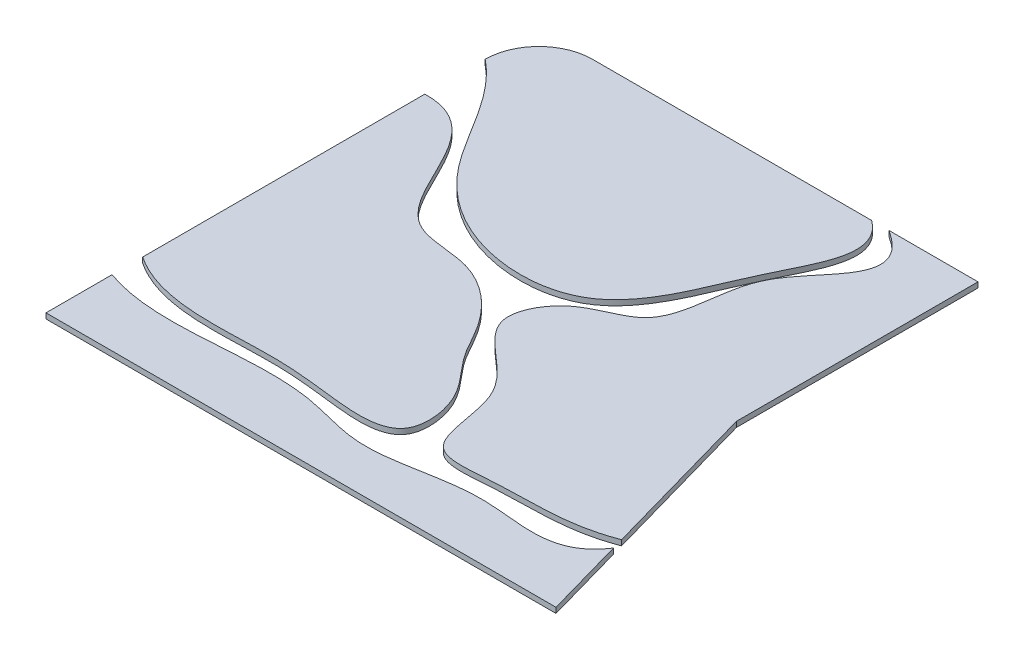
ISO-10303-21;
HEADER;
FILE_DESCRIPTION(('STEP AP214'),'2;1');
FILE_NAME('part.step','',(''),(''),'','','');
FILE_SCHEMA(('AUTOMOTIVE_DESIGN { 1 0 10303 214 1 1 1 1 }'));
ENDSEC;
DATA;
#1=APPLICATION_CONTEXT('core data for automotive mechanical design processes');
#2=APPLICATION_PROTOCOL_DEFINITION('international standard','automotive_design',2000,#1);
#3=PRODUCT_CONTEXT('',#1,'mechanical');
#4=PRODUCT('Part','Part','',(#3));
#5=PRODUCT_RELATED_PRODUCT_CATEGORY('part','',(#4));
#6=PRODUCT_DEFINITION_FORMATION('','',#4);
#7=PRODUCT_DEFINITION_CONTEXT('part definition',#1,'design');
#8=PRODUCT_DEFINITION('design','',#6,#7);
#9=PRODUCT_DEFINITION_SHAPE('','',#8);
#10=(LENGTH_UNIT() NAMED_UNIT(*) SI_UNIT(.MILLI.,.METRE.));
#11=(NAMED_UNIT(*) PLANE_ANGLE_UNIT() SI_UNIT($,.RADIAN.));
#12=(NAMED_UNIT(*) SI_UNIT($,.STERADIAN.) SOLID_ANGLE_UNIT());
#13=UNCERTAINTY_MEASURE_WITH_UNIT(LENGTH_MEASURE(1.E-05),#10,'distance_accuracy_value','');
#14=(GEOMETRIC_REPRESENTATION_CONTEXT(3) GLOBAL_UNCERTAINTY_ASSIGNED_CONTEXT((#13)) GLOBAL_UNIT_ASSIGNED_CONTEXT((#10,
#11,#12)) REPRESENTATION_CONTEXT('',''));
#15=CARTESIAN_POINT('',(0.,0.,0.));
#16=DIRECTION('',(0.,0.,1.));
#17=DIRECTION('',(1.,0.,0.));
#18=AXIS2_PLACEMENT_3D('',#15,#16,#17);
#19=CARTESIAN_POINT('',(-409.,10.,337.));
#20=DIRECTION('',(1.,0.,0.));
#21=DIRECTION('',(0.,0.,-1.));
#22=AXIS2_PLACEMENT_3D('',#19,#20,#21);
#23=PLANE('',#22);
#24=DIRECTION('',(0.,0.,1.));
#25=VECTOR('',#24,1.);
#26=CARTESIAN_POINT('',(-409.,0.,337.));
#27=LINE('',#26,#25);
#28=CARTESIAN_POINT('',(-409.,0.,337.));
#29=VERTEX_POINT('',#28);
#30=CARTESIAN_POINT('',(-409.,0.,460.));
#31=VERTEX_POINT('',#30);
#32=EDGE_CURVE('E13',#29,#31,#27,.T.);
#33=ORIENTED_EDGE('',*,*,#32,.T.);
#34=DIRECTION('',(0.,-1.,0.));
#35=VECTOR('',#34,1.);
#36=CARTESIAN_POINT('',(-409.,10.,460.));
#37=LINE('',#36,#35);
#38=CARTESIAN_POINT('',(-409.,10.,460.));
#39=VERTEX_POINT('',#38);
#40=EDGE_CURVE('E290',#39,#31,#37,.T.);
#41=ORIENTED_EDGE('',*,*,#40,.F.);
#42=DIRECTION('',(0.,0.,1.));
#43=VECTOR('',#42,1.);
#44=CARTESIAN_POINT('',(-409.,10.,337.));
#45=LINE('',#44,#43);
#46=CARTESIAN_POINT('',(-409.,10.,337.));
#47=VERTEX_POINT('',#46);
#48=EDGE_CURVE('E198',#47,#39,#45,.T.);
#49=ORIENTED_EDGE('',*,*,#48,.F.);
#50=DIRECTION('',(0.,-1.,0.));
#51=VECTOR('',#50,1.);
#52=CARTESIAN_POINT('',(-409.,10.,337.));
#53=LINE('',#52,#51);
#54=EDGE_CURVE('E238',#47,#29,#53,.T.);
#55=ORIENTED_EDGE('',*,*,#54,.T.);
#56=EDGE_LOOP('',(#33,#41,#49,#55));
#57=FACE_BOUND('',#56,.T.);
#58=ADVANCED_FACE('F194',(#57),#23,.F.);
#59=CARTESIAN_POINT('',(-409.,10.,460.));
#60=DIRECTION('',(0.,0.,-1.));
#61=DIRECTION('',(-1.,0.,0.));
#62=AXIS2_PLACEMENT_3D('',#59,#60,#61);
#63=PLANE('',#62);
#64=DIRECTION('',(1.,0.,0.));
#65=VECTOR('',#64,1.);
#66=CARTESIAN_POINT('',(-409.,0.,460.));
#67=LINE('',#66,#65);
#68=CARTESIAN_POINT('',(541.,0.,460.));
#69=VERTEX_POINT('',#68);
#70=EDGE_CURVE('E204',#31,#69,#67,.T.);
#71=ORIENTED_EDGE('',*,*,#70,.T.);
#72=DIRECTION('',(0.,-1.,0.));
#73=VECTOR('',#72,1.);
#74=CARTESIAN_POINT('',(541.,10.,460.));
#75=LINE('',#74,#73);
#76=CARTESIAN_POINT('',(541.,10.,460.));
#77=VERTEX_POINT('',#76);
#78=EDGE_CURVE('E252',#77,#69,#75,.T.);
#79=ORIENTED_EDGE('',*,*,#78,.F.);
#80=DIRECTION('',(1.,0.,0.));
#81=VECTOR('',#80,1.);
#82=CARTESIAN_POINT('',(-409.,10.,460.));
#83=LINE('',#82,#81);
#84=EDGE_CURVE('E230',#39,#77,#83,.T.);
#85=ORIENTED_EDGE('',*,*,#84,.F.);
#86=ORIENTED_EDGE('',*,*,#40,.T.);
#87=EDGE_LOOP('',(#71,#79,#85,#86));
#88=FACE_BOUND('',#87,.T.);
#89=ADVANCED_FACE('F284',(#88),#63,.F.);
#90=CARTESIAN_POINT('',(498.92367442162,10.,310.820300222107));
#91=DIRECTION('',(0.962449675986404,0.,-0.271460165021807));
#92=DIRECTION('',(-0.271460165021807,0.,-0.962449675986404));
#93=AXIS2_PLACEMENT_3D('',#90,#91,#92);
#94=PLANE('',#93);
#95=DIRECTION('',(0.271460165021807,0.,0.962449675986404));
#96=VECTOR('',#95,1.);
#97=CARTESIAN_POINT('',(498.92367442162,0.,310.820300222107));
#98=LINE('',#97,#96);
#99=CARTESIAN_POINT('',(498.92367442162,0.,310.820300222107));
#100=VERTEX_POINT('',#99);
#101=EDGE_CURVE('E254',#100,#69,#98,.T.);
#102=ORIENTED_EDGE('',*,*,#101,.F.);
#103=DIRECTION('',(0.,-1.,0.));
#104=VECTOR('',#103,1.);
#105=CARTESIAN_POINT('',(498.92367442162,10.,310.820300222107));
#106=LINE('',#105,#104);
#107=CARTESIAN_POINT('',(498.92367442162,10.,310.820300222107));
#108=VERTEX_POINT('',#107);
#109=EDGE_CURVE('E243',#108,#100,#106,.T.);
#110=ORIENTED_EDGE('',*,*,#109,.F.);
#111=DIRECTION('',(0.271460165021807,0.,0.962449675986404));
#112=VECTOR('',#111,1.);
#113=CARTESIAN_POINT('',(498.92367442162,10.,310.820300222107));
#114=LINE('',#113,#112);
#115=EDGE_CURVE('E271',#108,#77,#114,.T.);
#116=ORIENTED_EDGE('',*,*,#115,.T.);
#117=ORIENTED_EDGE('',*,*,#78,.T.);
#118=EDGE_LOOP('',(#102,#110,#116,#117));
#119=FACE_BOUND('',#118,.T.);
#120=ADVANCED_FACE('F255',(#119),#94,.T.);
#121=CARTESIAN_POINT('',(-409.,10.,337.));
#122=CARTESIAN_POINT('',(-282.053839650801,10.,381.850336930471));
#123=CARTESIAN_POINT('',(-112.633395527465,10.,318.254759818151));
#124=CARTESIAN_POINT('',(117.766188012156,10.,397.110113327518));
#125=CARTESIAN_POINT('',(292.633766386605,10.,325.190205846451));
#126=CARTESIAN_POINT('',(450.400424232774,10.,384.951409884759));
#127=CARTESIAN_POINT('',(498.92367442162,10.,310.820300222107));
#128=B_SPLINE_CURVE_WITH_KNOTS('',3,(#121,#122,#123,#124,#125,#126,#127),.UNSPECIFIED.,.F.,.F.,
(4,1,1,1,4),(0.,0.420681710108441,0.530959381444262,0.765334228131703,1.),.UNSPECIFIED.);
#129=DIRECTION('',(0.,-1.,0.));
#130=VECTOR('',#129,1.);
#131=SURFACE_OF_LINEAR_EXTRUSION('',#128,#130);
#132=CARTESIAN_POINT('',(-409.,0.,337.));
#133=CARTESIAN_POINT('',(-282.053839650801,0.,381.850336930471));
#134=CARTESIAN_POINT('',(-112.633395527465,0.,318.254759818151));
#135=CARTESIAN_POINT('',(117.766188012156,0.,397.110113327518));
#136=CARTESIAN_POINT('',(292.633766386605,0.,325.190205846451));
#137=CARTESIAN_POINT('',(450.400424232774,0.,384.951409884759));
#138=CARTESIAN_POINT('',(498.92367442162,0.,310.820300222107));
#139=B_SPLINE_CURVE_WITH_KNOTS('',3,(#132,#133,#134,#135,#136,#137,#138),.UNSPECIFIED.,.F.,.F.,
(4,1,1,1,4),(0.,0.420681710108441,0.530959381444262,0.765334228131703,1.),.UNSPECIFIED.);
#140=EDGE_CURVE('E247',#29,#100,#139,.T.);
#141=ORIENTED_EDGE('',*,*,#140,.F.);
#142=ORIENTED_EDGE('',*,*,#54,.F.);
#143=EDGE_CURVE('E249',#47,#108,#128,.T.);
#144=ORIENTED_EDGE('',*,*,#143,.T.);
#145=ORIENTED_EDGE('',*,*,#109,.T.);
#146=EDGE_LOOP('',(#141,#142,#144,#145));
#147=FACE_BOUND('',#146,.T.);
#148=ADVANCED_FACE('F245',(#147),#131,.T.);
#149=CARTESIAN_POINT('',(52.4484261604394,10.,371.884447690763));
#150=DIRECTION('',(0.,-1.,0.));
#151=DIRECTION('',(0.,0.,-1.));
#152=AXIS2_PLACEMENT_3D('',#149,#150,#151);
#153=PLANE('',#152);
#154=ORIENTED_EDGE('',*,*,#48,.T.);
#155=ORIENTED_EDGE('',*,*,#84,.T.);
#156=ORIENTED_EDGE('',*,*,#115,.F.);
#157=ORIENTED_EDGE('',*,*,#143,.F.);
#158=EDGE_LOOP('',(#154,#155,#156,#157));
#159=FACE_BOUND('',#158,.T.);
#160=ADVANCED_FACE('F196',(#159),#153,.F.);
#161=CARTESIAN_POINT('',(52.4484261604394,0.,371.884447690763));
#162=DIRECTION('',(0.,-1.,0.));
#163=DIRECTION('',(0.,0.,-1.));
#164=AXIS2_PLACEMENT_3D('',#161,#162,#163);
#165=PLANE('',#164);
#166=ORIENTED_EDGE('',*,*,#32,.F.);
#167=ORIENTED_EDGE('',*,*,#140,.T.);
#168=ORIENTED_EDGE('',*,*,#101,.T.);
#169=ORIENTED_EDGE('',*,*,#70,.F.);
#170=EDGE_LOOP('',(#166,#167,#168,#169));
#171=FACE_BOUND('',#170,.T.);
#172=ADVANCED_FACE('F257',(#171),#165,.T.);
#173=CLOSED_SHELL('',(#58,#89,#120,#148,#160,#172));
#174=MANIFOLD_SOLID_BREP('B2',#173);
#175=CARTESIAN_POINT('',(243.,10.,-458.));
#176=DIRECTION('',(0.,0.,-1.));
#177=DIRECTION('',(-1.,0.,0.));
#178=AXIS2_PLACEMENT_3D('',#175,#176,#177);
#179=PLANE('',#178);
#180=DIRECTION('',(1.,0.,0.));
#181=VECTOR('',#180,1.);
#182=CARTESIAN_POINT('',(243.,0.,-458.));
#183=LINE('',#182,#181);
#184=CARTESIAN_POINT('',(243.,0.,-458.));
#185=VERTEX_POINT('',#184);
#186=CARTESIAN_POINT('',(409.,0.,-458.));
#187=VERTEX_POINT('',#186);
#188=EDGE_CURVE('E192',#185,#187,#183,.T.);
#189=ORIENTED_EDGE('',*,*,#188,.F.);
#190=DIRECTION('',(0.,-1.,0.));
#191=VECTOR('',#190,1.);
#192=CARTESIAN_POINT('',(243.,10.,-458.));
#193=LINE('',#192,#191);
#194=CARTESIAN_POINT('',(243.,10.,-458.));
#195=VERTEX_POINT('',#194);
#196=EDGE_CURVE('E386',#195,#185,#193,.T.);
#197=ORIENTED_EDGE('',*,*,#196,.F.);
#198=DIRECTION('',(1.,0.,0.));
#199=VECTOR('',#198,1.);
#200=CARTESIAN_POINT('',(243.,10.,-458.));
#201=LINE('',#200,#199);
#202=CARTESIAN_POINT('',(409.,10.,-458.));
#203=VERTEX_POINT('',#202);
#204=EDGE_CURVE('E343',#195,#203,#201,.T.);
#205=ORIENTED_EDGE('',*,*,#204,.T.);
#206=DIRECTION('',(0.,-1.,0.));
#207=VECTOR('',#206,1.);
#208=CARTESIAN_POINT('',(409.,10.,-458.));
#209=LINE('',#208,#207);
#210=EDGE_CURVE('E358',#203,#187,#209,.T.);
#211=ORIENTED_EDGE('',*,*,#210,.T.);
#212=EDGE_LOOP('',(#189,#197,#205,#211));
#213=FACE_BOUND('',#212,.T.);
#214=ADVANCED_FACE('F339',(#213),#179,.T.);
#215=CARTESIAN_POINT('',(243.,10.,-458.));
#216=CARTESIAN_POINT('',(349.792563252305,10.,-390.973836457909));
#217=CARTESIAN_POINT('',(213.962742630092,10.,-317.054977902579));
#218=CARTESIAN_POINT('',(186.913088276192,10.,-187.446593619725));
#219=CARTESIAN_POINT('',(177.707663743902,10.,-74.8563343666777));
#220=CARTESIAN_POINT('',(63.9301788112853,10.,-57.2135877029868));
#221=CARTESIAN_POINT('',(-6.80416306031822,10.,75.3169661254874));
#222=CARTESIAN_POINT('',(170.350641389304,10.,139.191609600105));
#223=CARTESIAN_POINT('',(143.99179250364,10.,330.865859780761));
#224=CARTESIAN_POINT('',(329.024238386071,10.,307.915291766622));
#225=CARTESIAN_POINT('',(414.200144681433,10.,319.688768204602));
#226=CARTESIAN_POINT('',(493.02995152982,10.,289.924373605724));
#227=B_SPLINE_CURVE_WITH_KNOTS('',3,(#215,#216,#217,#218,#219,#220,#221,#222,#223,#224,#225,
#226),.UNSPECIFIED.,.F.,.F.,(4,1,1,1,1,1,1,1,1,4),(0.,0.184875451188136,0.245347746460645,
0.332115563878046,0.42031227348456,0.488752844080418,0.627085994102684,0.747050316737015,
0.817526215778541,1.),.UNSPECIFIED.);
#228=DIRECTION('',(0.,-1.,0.));
#229=VECTOR('',#228,1.);
#230=SURFACE_OF_LINEAR_EXTRUSION('',#227,#229);
#231=CARTESIAN_POINT('',(243.,0.,-458.));
#232=CARTESIAN_POINT('',(349.792563252305,0.,-390.973836457909));
#233=CARTESIAN_POINT('',(213.962742630092,0.,-317.054977902579));
#234=CARTESIAN_POINT('',(186.913088276192,0.,-187.446593619725));
#235=CARTESIAN_POINT('',(177.707663743902,0.,-74.8563343666777));
#236=CARTESIAN_POINT('',(63.9301788112853,0.,-57.2135877029868));
#237=CARTESIAN_POINT('',(-6.80416306031822,0.,75.3169661254874));
#238=CARTESIAN_POINT('',(170.350641389304,0.,139.191609600105));
#239=CARTESIAN_POINT('',(143.99179250364,0.,330.865859780761));
#240=CARTESIAN_POINT('',(329.024238386071,0.,307.915291766622));
#241=CARTESIAN_POINT('',(414.200144681433,0.,319.688768204602));
#242=CARTESIAN_POINT('',(493.02995152982,0.,289.924373605724));
#243=B_SPLINE_CURVE_WITH_KNOTS('',3,(#231,#232,#233,#234,#235,#236,#237,#238,#239,#240,#241,
#242),.UNSPECIFIED.,.F.,.F.,(4,1,1,1,1,1,1,1,1,4),(0.,0.184875451188136,0.245347746460645,
0.332115563878046,0.42031227348456,0.488752844080418,0.627085994102684,0.747050316737015,
0.817526215778541,1.),.UNSPECIFIED.);
#244=CARTESIAN_POINT('',(493.02995152982,0.,289.924373605724));
#245=VERTEX_POINT('',#244);
#246=EDGE_CURVE('E397',#185,#245,#243,.T.);
#247=ORIENTED_EDGE('',*,*,#246,.T.);
#248=DIRECTION('',(0.,-1.,0.));
#249=VECTOR('',#248,1.);
#250=CARTESIAN_POINT('',(493.02995152982,10.,289.924373605724));
#251=LINE('',#250,#249);
#252=CARTESIAN_POINT('',(493.02995152982,10.,289.924373605724));
#253=VERTEX_POINT('',#252);
#254=EDGE_CURVE('E390',#253,#245,#251,.T.);
#255=ORIENTED_EDGE('',*,*,#254,.F.);
#256=EDGE_CURVE('E408',#195,#253,#227,.T.);
#257=ORIENTED_EDGE('',*,*,#256,.F.);
#258=ORIENTED_EDGE('',*,*,#196,.T.);
#259=EDGE_LOOP('',(#247,#255,#257,#258));
#260=FACE_BOUND('',#259,.T.);
#261=ADVANCED_FACE('F398',(#260),#230,.F.);
#262=CARTESIAN_POINT('',(409.,10.,-8.00000000000006));
#263=DIRECTION('',(0.962449675986404,0.,-0.271460165021806));
#264=DIRECTION('',(-0.271460165021806,0.,-0.962449675986404));
#265=AXIS2_PLACEMENT_3D('',#262,#263,#264);
#266=PLANE('',#265);
#267=DIRECTION('',(0.271460165021807,0.,0.962449675986404));
#268=VECTOR('',#267,1.);
#269=CARTESIAN_POINT('',(409.,0.,-8.00000000000006));
#270=LINE('',#269,#268);
#271=CARTESIAN_POINT('',(409.,0.,-8.00000000000006));
#272=VERTEX_POINT('',#271);
#273=EDGE_CURVE('E393',#272,#245,#270,.T.);
#274=ORIENTED_EDGE('',*,*,#273,.F.);
#275=DIRECTION('',(0.,-1.,0.));
#276=VECTOR('',#275,1.);
#277=CARTESIAN_POINT('',(409.,10.,-8.00000000000006));
#278=LINE('',#277,#276);
#279=CARTESIAN_POINT('',(409.,10.,-8.00000000000006));
#280=VERTEX_POINT('',#279);
#281=EDGE_CURVE('E375',#280,#272,#278,.T.);
#282=ORIENTED_EDGE('',*,*,#281,.F.);
#283=DIRECTION('',(0.271460165021807,0.,0.962449675986404));
#284=VECTOR('',#283,1.);
#285=CARTESIAN_POINT('',(409.,10.,-8.00000000000006));
#286=LINE('',#285,#284);
#287=EDGE_CURVE('E395',#280,#253,#286,.T.);
#288=ORIENTED_EDGE('',*,*,#287,.T.);
#289=ORIENTED_EDGE('',*,*,#254,.T.);
#290=EDGE_LOOP('',(#274,#282,#288,#289));
#291=FACE_BOUND('',#290,.T.);
#292=ADVANCED_FACE('F391',(#291),#266,.T.);
#293=CARTESIAN_POINT('',(409.,10.,-458.));
#294=DIRECTION('',(1.,0.,0.));
#295=DIRECTION('',(0.,0.,-1.));
#296=AXIS2_PLACEMENT_3D('',#293,#294,#295);
#297=PLANE('',#296);
#298=DIRECTION('',(0.,0.,1.));
#299=VECTOR('',#298,1.);
#300=CARTESIAN_POINT('',(409.,0.,-458.));
#301=LINE('',#300,#299);
#302=EDGE_CURVE('E349',#187,#272,#301,.T.);
#303=ORIENTED_EDGE('',*,*,#302,.F.);
#304=ORIENTED_EDGE('',*,*,#210,.F.);
#305=DIRECTION('',(0.,0.,1.));
#306=VECTOR('',#305,1.);
#307=CARTESIAN_POINT('',(409.,10.,-458.));
#308=LINE('',#307,#306);
#309=EDGE_CURVE('E435',#203,#280,#308,.T.);
#310=ORIENTED_EDGE('',*,*,#309,.T.);
#311=ORIENTED_EDGE('',*,*,#281,.T.);
#312=EDGE_LOOP('',(#303,#304,#310,#311));
#313=FACE_BOUND('',#312,.T.);
#314=ADVANCED_FACE('F424',(#313),#297,.T.);
#315=CARTESIAN_POINT('',(29.6846515869412,10.,50.0522547968441));
#316=DIRECTION('',(0.,1.,0.));
#317=DIRECTION('',(0.,0.,1.));
#318=AXIS2_PLACEMENT_3D('',#315,#316,#317);
#319=PLANE('',#318);
#320=ORIENTED_EDGE('',*,*,#204,.F.);
#321=ORIENTED_EDGE('',*,*,#256,.T.);
#322=ORIENTED_EDGE('',*,*,#287,.F.);
#323=ORIENTED_EDGE('',*,*,#309,.F.);
#324=EDGE_LOOP('',(#320,#321,#322,#323));
#325=FACE_BOUND('',#324,.T.);
#326=ADVANCED_FACE('F341',(#325),#319,.T.);
#327=CARTESIAN_POINT('',(29.6846515869412,0.,50.0522547968441));
#328=DIRECTION('',(0.,1.,0.));
#329=DIRECTION('',(0.,0.,1.));
#330=AXIS2_PLACEMENT_3D('',#327,#328,#329);
#331=PLANE('',#330);
#332=ORIENTED_EDGE('',*,*,#188,.T.);
#333=ORIENTED_EDGE('',*,*,#302,.T.);
#334=ORIENTED_EDGE('',*,*,#273,.T.);
#335=ORIENTED_EDGE('',*,*,#246,.F.);
#336=EDGE_LOOP('',(#332,#333,#334,#335));
#337=FACE_BOUND('',#336,.T.);
#338=ADVANCED_FACE('F401',(#337),#331,.F.);
#339=CLOSED_SHELL('',(#214,#261,#292,#314,#326,#338));
#340=MANIFOLD_SOLID_BREP('B7',#339);
#341=CARTESIAN_POINT('',(-409.,10.,-245.580356435994));
#342=DIRECTION('',(1.,0.,0.));
#343=DIRECTION('',(0.,0.,-1.));
#344=AXIS2_PLACEMENT_3D('',#341,#342,#343);
#345=PLANE('',#344);
#346=DIRECTION('',(0.,0.,1.));
#347=VECTOR('',#346,1.);
#348=CARTESIAN_POINT('',(-409.,0.,-245.580356435994));
#349=LINE('',#348,#347);
#350=CARTESIAN_POINT('',(-409.,0.,-245.580356435994));
#351=VERTEX_POINT('',#350);
#352=CARTESIAN_POINT('',(-409.,0.,279.882850732633));
#353=VERTEX_POINT('',#352);
#354=EDGE_CURVE('E337',#351,#353,#349,.T.);
#355=ORIENTED_EDGE('',*,*,#354,.T.);
#356=DIRECTION('',(0.,-1.,0.));
#357=VECTOR('',#356,1.);
#358=CARTESIAN_POINT('',(-409.,10.,279.882850732633));
#359=LINE('',#358,#357);
#360=CARTESIAN_POINT('',(-409.,10.,279.882850732633));
#361=VERTEX_POINT('',#360);
#362=EDGE_CURVE('E502',#361,#353,#359,.T.);
#363=ORIENTED_EDGE('',*,*,#362,.F.);
#364=DIRECTION('',(0.,0.,1.));
#365=VECTOR('',#364,1.);
#366=CARTESIAN_POINT('',(-409.,10.,-245.580356435994));
#367=LINE('',#366,#365);
#368=CARTESIAN_POINT('',(-409.,10.,-245.580356435994));
#369=VERTEX_POINT('',#368);
#370=EDGE_CURVE('E487',#369,#361,#367,.T.);
#371=ORIENTED_EDGE('',*,*,#370,.F.);
#372=DIRECTION('',(0.,-1.,0.));
#373=VECTOR('',#372,1.);
#374=CARTESIAN_POINT('',(-409.,10.,-245.580356435994));
#375=LINE('',#374,#373);
#376=EDGE_CURVE('E507',#369,#351,#375,.T.);
#377=ORIENTED_EDGE('',*,*,#376,.T.);
#378=EDGE_LOOP('',(#355,#363,#371,#377));
#379=FACE_BOUND('',#378,.T.);
#380=ADVANCED_FACE('F483',(#379),#345,.F.);
#381=CARTESIAN_POINT('',(-409.,10.,-245.580356435994));
#382=CARTESIAN_POINT('',(-275.993080970983,10.,-249.674647460106));
#383=CARTESIAN_POINT('',(-283.602777576601,10.,-7.37078898554756));
#384=CARTESIAN_POINT('',(-74.8037457434748,10.,-19.7446765974817));
#385=CARTESIAN_POINT('',(8.39005354075907,10.,58.2039710558512));
#386=CARTESIAN_POINT('',(52.9777936483039,10.,153.228845865769));
#387=CARTESIAN_POINT('',(116.989970072584,10.,206.854063036206));
#388=CARTESIAN_POINT('',(133.000643295061,10.,345.497902872236));
#389=CARTESIAN_POINT('',(-10.0477239718008,10.,329.363469332077));
#390=CARTESIAN_POINT('',(-171.745361019722,10.,310.363611114728));
#391=CARTESIAN_POINT('',(-318.826566789238,10.,340.399765197704));
#392=CARTESIAN_POINT('',(-409.,10.,279.882850732633));
#393=B_SPLINE_CURVE_WITH_KNOTS('',3,(#381,#382,#383,#384,#385,#386,#387,#388,#389,#390,#391,
#392),.UNSPECIFIED.,.F.,.F.,(4,1,1,1,1,1,1,1,1,4),(0.,0.233311569330583,0.306255308358107,
0.417893684448506,0.463878140195967,0.538957902094254,0.605999424294294,0.700982217954226,
0.770983118891794,1.),.UNSPECIFIED.);
#394=DIRECTION('',(0.,-1.,0.));
#395=VECTOR('',#394,1.);
#396=SURFACE_OF_LINEAR_EXTRUSION('',#393,#395);
#397=CARTESIAN_POINT('',(-409.,0.,-245.580356435994));
#398=CARTESIAN_POINT('',(-275.993080970983,0.,-249.674647460106));
#399=CARTESIAN_POINT('',(-283.602777576601,0.,-7.37078898554756));
#400=CARTESIAN_POINT('',(-74.8037457434748,0.,-19.7446765974817));
#401=CARTESIAN_POINT('',(8.39005354075907,0.,58.2039710558512));
#402=CARTESIAN_POINT('',(52.9777936483039,0.,153.228845865769));
#403=CARTESIAN_POINT('',(116.989970072584,0.,206.854063036206));
#404=CARTESIAN_POINT('',(133.000643295061,0.,345.497902872236));
#405=CARTESIAN_POINT('',(-10.0477239718008,0.,329.363469332077));
#406=CARTESIAN_POINT('',(-171.745361019722,0.,310.363611114728));
#407=CARTESIAN_POINT('',(-318.826566789238,0.,340.399765197704));
#408=CARTESIAN_POINT('',(-409.,0.,279.882850732633));
#409=B_SPLINE_CURVE_WITH_KNOTS('',3,(#397,#398,#399,#400,#401,#402,#403,#404,#405,#406,#407,
#408),.UNSPECIFIED.,.F.,.F.,(4,1,1,1,1,1,1,1,1,4),(0.,0.233311569330583,0.306255308358107,
0.417893684448506,0.463878140195967,0.538957902094254,0.605999424294294,0.700982217954226,
0.770983118891794,1.),.UNSPECIFIED.);
#410=EDGE_CURVE('E493',#351,#353,#409,.T.);
#411=ORIENTED_EDGE('',*,*,#410,.F.);
#412=ORIENTED_EDGE('',*,*,#376,.F.);
#413=EDGE_CURVE('E512',#369,#361,#393,.T.);
#414=ORIENTED_EDGE('',*,*,#413,.T.);
#415=ORIENTED_EDGE('',*,*,#362,.T.);
#416=EDGE_LOOP('',(#411,#412,#414,#415));
#417=FACE_BOUND('',#416,.T.);
#418=ADVANCED_FACE('F517',(#417),#396,.T.);
#419=CARTESIAN_POINT('',(79.7157739056211,10.,176.348928931181));
#420=DIRECTION('',(0.,1.,0.));
#421=DIRECTION('',(0.,0.,1.));
#422=AXIS2_PLACEMENT_3D('',#419,#420,#421);
#423=PLANE('',#422);
#424=ORIENTED_EDGE('',*,*,#370,.T.);
#425=ORIENTED_EDGE('',*,*,#413,.F.);
#426=EDGE_LOOP('',(#424,#425));
#427=FACE_BOUND('',#426,.T.);
#428=ADVANCED_FACE('F485',(#427),#423,.T.);
#429=CARTESIAN_POINT('',(79.7157739056211,0.,176.348928931181));
#430=DIRECTION('',(0.,1.,0.));
#431=DIRECTION('',(0.,0.,1.));
#432=AXIS2_PLACEMENT_3D('',#429,#430,#431);
#433=PLANE('',#432);
#434=ORIENTED_EDGE('',*,*,#354,.F.);
#435=ORIENTED_EDGE('',*,*,#410,.T.);
#436=EDGE_LOOP('',(#434,#435));
#437=FACE_BOUND('',#436,.T.);
#438=ADVANCED_FACE('F529',(#437),#433,.F.);
#439=CLOSED_SHELL('',(#380,#418,#428,#438));
#440=MANIFOLD_SOLID_BREP('B186',#439);
#441=CARTESIAN_POINT('',(210.868291071106,10.,-458.));
#442=CARTESIAN_POINT('',(269.589316795371,10.,-414.930776234804));
#443=CARTESIAN_POINT('',(222.943597072288,10.,-326.171009864355));
#444=CARTESIAN_POINT('',(177.782564771793,10.,-228.677919450615));
#445=CARTESIAN_POINT('',(145.156787101026,10.,-147.871813619729));
#446=CARTESIAN_POINT('',(67.2238801149206,10.,-35.6662527112723));
#447=CARTESIAN_POINT('',(-119.04579999059,10.,-36.5041853177864));
#448=CARTESIAN_POINT('',(-246.879340720751,10.,-130.670668224028));
#449=CARTESIAN_POINT('',(-319.221459074542,10.,-251.456304013504));
#450=CARTESIAN_POINT('',(-366.458980172564,10.,-324.006011188901));
#451=CARTESIAN_POINT('',(-409.,10.,-358.));
#452=B_SPLINE_CURVE_WITH_KNOTS('',3,(#441,#442,#443,#444,#445,#446,#447,#448,#449,#450,#451),
.UNSPECIFIED.,.F.,.F.,(4,1,1,1,1,1,1,1,4),(0.,0.163728441763409,0.23537721068706,
0.313668619137444,0.410963639491976,0.60302781399317,0.754879505968329,0.848370003161574,1.),.UNSPECIFIED.);
#453=DIRECTION('',(0.,-1.,0.));
#454=VECTOR('',#453,1.);
#455=SURFACE_OF_LINEAR_EXTRUSION('',#452,#454);
#456=CARTESIAN_POINT('',(210.868291071106,0.,-458.));
#457=CARTESIAN_POINT('',(269.589316795371,0.,-414.930776234804));
#458=CARTESIAN_POINT('',(222.943597072288,0.,-326.171009864355));
#459=CARTESIAN_POINT('',(177.782564771793,0.,-228.677919450615));
#460=CARTESIAN_POINT('',(145.156787101026,0.,-147.871813619729));
#461=CARTESIAN_POINT('',(67.2238801149206,0.,-35.6662527112723));
#462=CARTESIAN_POINT('',(-119.04579999059,0.,-36.5041853177864));
#463=CARTESIAN_POINT('',(-246.879340720751,0.,-130.670668224028));
#464=CARTESIAN_POINT('',(-319.221459074542,0.,-251.456304013504));
#465=CARTESIAN_POINT('',(-366.458980172564,0.,-324.006011188901));
#466=CARTESIAN_POINT('',(-409.,0.,-358.));
#467=B_SPLINE_CURVE_WITH_KNOTS('',3,(#456,#457,#458,#459,#460,#461,#462,#463,#464,#465,#466),
.UNSPECIFIED.,.F.,.F.,(4,1,1,1,1,1,1,1,4),(0.,0.163728441763409,0.23537721068706,
0.313668619137444,0.410963639491976,0.60302781399317,0.754879505968329,0.848370003161574,1.),.UNSPECIFIED.);
#468=CARTESIAN_POINT('',(210.868291071106,0.,-458.));
#469=VERTEX_POINT('',#468);
#470=CARTESIAN_POINT('',(-409.,0.,-358.));
#471=VERTEX_POINT('',#470);
#472=EDGE_CURVE('E604',#469,#471,#467,.T.);
#473=ORIENTED_EDGE('',*,*,#472,.F.);
#474=DIRECTION('',(0.,-1.,0.));
#475=VECTOR('',#474,1.);
#476=CARTESIAN_POINT('',(210.868291071106,10.,-458.));
#477=LINE('',#476,#475);
#478=CARTESIAN_POINT('',(210.868291071106,10.,-458.));
#479=VERTEX_POINT('',#478);
#480=EDGE_CURVE('E481',#479,#469,#477,.T.);
#481=ORIENTED_EDGE('',*,*,#480,.F.);
#482=CARTESIAN_POINT('',(-409.,10.,-358.));
#483=VERTEX_POINT('',#482);
#484=EDGE_CURVE('E602',#479,#483,#452,.T.);
#485=ORIENTED_EDGE('',*,*,#484,.T.);
#486=DIRECTION('',(0.,-1.,0.));
#487=VECTOR('',#486,1.);
#488=CARTESIAN_POINT('',(-409.,10.,-358.));
#489=LINE('',#488,#487);
#490=EDGE_CURVE('E600',#483,#471,#489,.T.);
#491=ORIENTED_EDGE('',*,*,#490,.T.);
#492=EDGE_LOOP('',(#473,#481,#485,#491));
#493=FACE_BOUND('',#492,.T.);
#494=ADVANCED_FACE('F566',(#493),#455,.T.);
#495=CARTESIAN_POINT('',(0.,10.,-458.));
#496=DIRECTION('',(0.,0.,-1.));
#497=DIRECTION('',(-1.,0.,0.));
#498=AXIS2_PLACEMENT_3D('',#495,#496,#497);
#499=PLANE('',#498);
#500=DIRECTION('',(1.,0.,0.));
#501=VECTOR('',#500,1.);
#502=CARTESIAN_POINT('',(0.,0.,-458.));
#503=LINE('',#502,#501);
#504=CARTESIAN_POINT('',(-309.,0.,-458.));
#505=VERTEX_POINT('',#504);
#506=EDGE_CURVE('E622',#505,#469,#503,.T.);
#507=ORIENTED_EDGE('',*,*,#506,.F.);
#508=DIRECTION('',(0.,-1.,0.));
#509=VECTOR('',#508,1.);
#510=CARTESIAN_POINT('',(-309.,10.,-458.));
#511=LINE('',#510,#509);
#512=CARTESIAN_POINT('',(-309.,10.,-458.));
#513=VERTEX_POINT('',#512);
#514=EDGE_CURVE('E575',#513,#505,#511,.T.);
#515=ORIENTED_EDGE('',*,*,#514,.F.);
#516=DIRECTION('',(1.,0.,0.));
#517=VECTOR('',#516,1.);
#518=CARTESIAN_POINT('',(0.,10.,-458.));
#519=LINE('',#518,#517);
#520=EDGE_CURVE('E610',#513,#479,#519,.T.);
#521=ORIENTED_EDGE('',*,*,#520,.T.);
#522=ORIENTED_EDGE('',*,*,#480,.T.);
#523=EDGE_LOOP('',(#507,#515,#521,#522));
#524=FACE_BOUND('',#523,.T.);
#525=ADVANCED_FACE('F612',(#524),#499,.T.);
#526=CARTESIAN_POINT('',(-309.,10.,-358.));
#527=DIRECTION('',(0.,-1.,0.));
#528=DIRECTION('',(0.,0.,-1.));
#529=AXIS2_PLACEMENT_3D('',#526,#527,#528);
#530=CYLINDRICAL_SURFACE('',#529,100.);
#531=CARTESIAN_POINT('',(-309.,0.,-358.));
#532=DIRECTION('',(0.,1.,0.));
#533=DIRECTION('',(0.,0.,1.));
#534=AXIS2_PLACEMENT_3D('',#531,#532,#533);
#535=CIRCLE('',#534,100.);
#536=EDGE_CURVE('E611',#505,#471,#535,.T.);
#537=ORIENTED_EDGE('',*,*,#536,.T.);
#538=ORIENTED_EDGE('',*,*,#490,.F.);
#539=CARTESIAN_POINT('',(-309.,10.,-358.));
#540=DIRECTION('',(0.,1.,0.));
#541=DIRECTION('',(0.,0.,1.));
#542=AXIS2_PLACEMENT_3D('',#539,#540,#541);
#543=CIRCLE('',#542,100.);
#544=EDGE_CURVE('E583',#513,#483,#543,.T.);
#545=ORIENTED_EDGE('',*,*,#544,.F.);
#546=ORIENTED_EDGE('',*,*,#514,.T.);
#547=EDGE_LOOP('',(#537,#538,#545,#546));
#548=FACE_BOUND('',#547,.T.);
#549=ADVANCED_FACE('F628',(#548),#530,.T.);
#550=CARTESIAN_POINT('',(0.,10.,0.));
#551=DIRECTION('',(0.,1.,0.));
#552=DIRECTION('',(0.,0.,1.));
#553=AXIS2_PLACEMENT_3D('',#550,#551,#552);
#554=PLANE('',#553);
#555=ORIENTED_EDGE('',*,*,#484,.F.);
#556=ORIENTED_EDGE('',*,*,#520,.F.);
#557=ORIENTED_EDGE('',*,*,#544,.T.);
#558=EDGE_LOOP('',(#555,#556,#557));
#559=FACE_BOUND('',#558,.T.);
#560=ADVANCED_FACE('F609',(#559),#554,.T.);
#561=CARTESIAN_POINT('',(0.,0.,0.));
#562=DIRECTION('',(0.,1.,0.));
#563=DIRECTION('',(0.,0.,1.));
#564=AXIS2_PLACEMENT_3D('',#561,#562,#563);
#565=PLANE('',#564);
#566=ORIENTED_EDGE('',*,*,#472,.T.);
#567=ORIENTED_EDGE('',*,*,#536,.F.);
#568=ORIENTED_EDGE('',*,*,#506,.T.);
#569=EDGE_LOOP('',(#566,#567,#568));
#570=FACE_BOUND('',#569,.T.);
#571=ADVANCED_FACE('F630',(#570),#565,.F.);
#572=CLOSED_SHELL('',(#494,#525,#549,#560,#571));
#573=MANIFOLD_SOLID_BREP('B331',#572);
#574=ADVANCED_BREP_SHAPE_REPRESENTATION('',(#18,#174,#340,#440,#573),#14);
#575=SHAPE_DEFINITION_REPRESENTATION(#9,#574);
ENDSEC;
END-ISO-10303-21;
